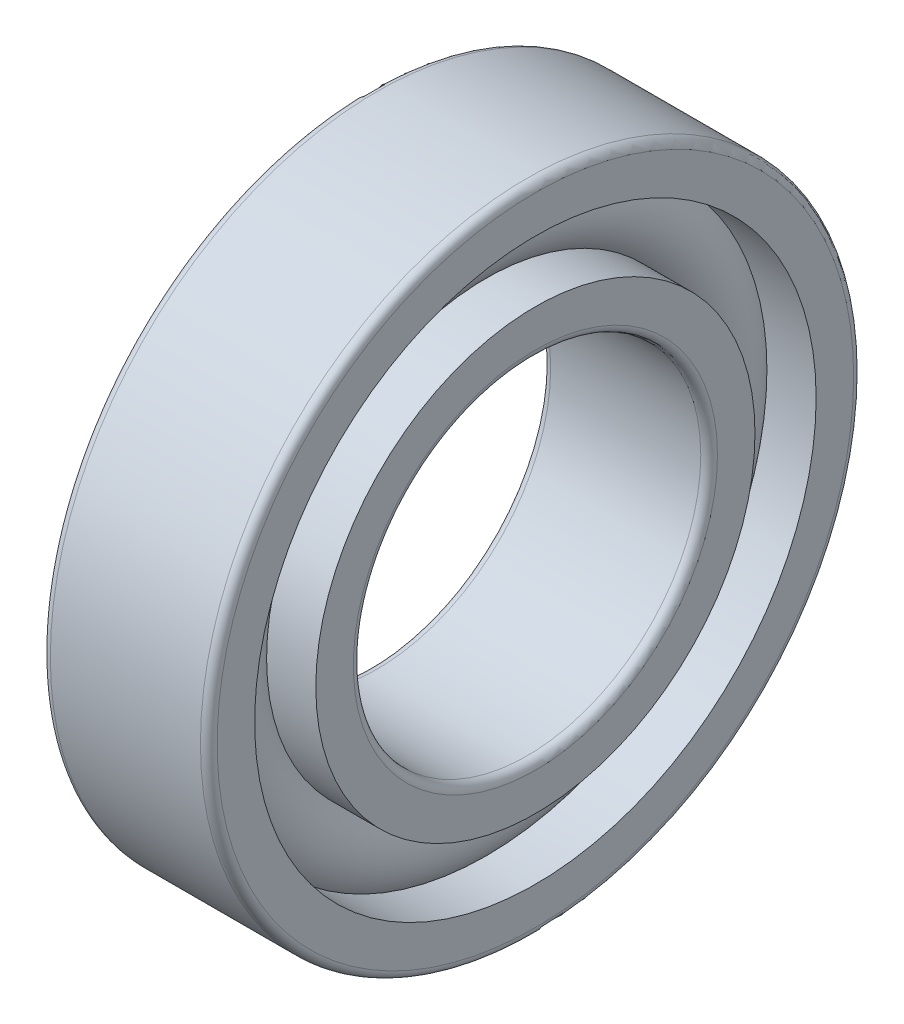
ISO-10303-21;
HEADER;
FILE_DESCRIPTION(('STEP AP214'),'2;1');
FILE_NAME('part.step','',(''),(''),'','','');
FILE_SCHEMA(('AUTOMOTIVE_DESIGN { 1 0 10303 214 1 1 1 1 }'));
ENDSEC;
DATA;
#1=APPLICATION_CONTEXT('core data for automotive mechanical design processes');
#2=APPLICATION_PROTOCOL_DEFINITION('international standard','automotive_design',2000,#1);
#3=PRODUCT_CONTEXT('',#1,'mechanical');
#4=PRODUCT('Part','Part','',(#3));
#5=PRODUCT_RELATED_PRODUCT_CATEGORY('part','',(#4));
#6=PRODUCT_DEFINITION_FORMATION('','',#4);
#7=PRODUCT_DEFINITION_CONTEXT('part definition',#1,'design');
#8=PRODUCT_DEFINITION('design','',#6,#7);
#9=PRODUCT_DEFINITION_SHAPE('','',#8);
#10=(LENGTH_UNIT() NAMED_UNIT(*) SI_UNIT(.MILLI.,.METRE.));
#11=(NAMED_UNIT(*) PLANE_ANGLE_UNIT() SI_UNIT($,.RADIAN.));
#12=(NAMED_UNIT(*) SI_UNIT($,.STERADIAN.) SOLID_ANGLE_UNIT());
#13=UNCERTAINTY_MEASURE_WITH_UNIT(LENGTH_MEASURE(1.E-05),#10,'distance_accuracy_value','');
#14=(GEOMETRIC_REPRESENTATION_CONTEXT(3) GLOBAL_UNCERTAINTY_ASSIGNED_CONTEXT((#13)) GLOBAL_UNIT_ASSIGNED_CONTEXT((#10,
#11,#12)) REPRESENTATION_CONTEXT('',''));
#15=CARTESIAN_POINT('',(0.,0.,0.));
#16=DIRECTION('',(0.,0.,1.));
#17=DIRECTION('',(1.,0.,0.));
#18=AXIS2_PLACEMENT_3D('',#15,#16,#17);
#19=CARTESIAN_POINT('',(0.,0.,0.));
#20=DIRECTION('',(-1.,0.,0.));
#21=DIRECTION('',(0.,0.,1.));
#22=AXIS2_PLACEMENT_3D('',#19,#20,#21);
#23=TOROIDAL_SURFACE('',#22,18.,3.3);
#24=CARTESIAN_POINT('',(2.45967477524977,0.,0.));
#25=DIRECTION('',(-1.,0.,0.));
#26=DIRECTION('',(0.,0.,1.));
#27=AXIS2_PLACEMENT_3D('',#24,#25,#26);
#28=CIRCLE('',#27,20.2);
#29=CARTESIAN_POINT('',(2.45967477524977,0.,20.2));
#30=VERTEX_POINT('',#29);
#31=EDGE_CURVE('E35',#30,#30,#28,.F.);
#32=ORIENTED_EDGE('',*,*,#31,.T.);
#33=EDGE_LOOP('',(#32));
#34=FACE_BOUND('',#33,.T.);
#35=CARTESIAN_POINT('',(2.45967477524977,0.,0.));
#36=DIRECTION('',(-1.,0.,0.));
#37=DIRECTION('',(0.,0.,1.));
#38=AXIS2_PLACEMENT_3D('',#35,#36,#37);
#39=CIRCLE('',#38,15.8);
#40=CARTESIAN_POINT('',(2.45967477524977,0.,15.8));
#41=VERTEX_POINT('',#40);
#42=EDGE_CURVE('E10',#41,#41,#39,.T.);
#43=ORIENTED_EDGE('',*,*,#42,.T.);
#44=EDGE_LOOP('',(#43));
#45=FACE_BOUND('',#44,.T.);
#46=ADVANCED_FACE('F31',(#34,#45),#23,.T.);
#47=CARTESIAN_POINT('',(-20.6375,0.,0.));
#48=DIRECTION('',(1.,0.,0.));
#49=DIRECTION('',(0.,0.,-1.));
#50=AXIS2_PLACEMENT_3D('',#47,#48,#49);
#51=CYLINDRICAL_SURFACE('',#50,15.8);
#52=CARTESIAN_POINT('',(6.,0.,0.));
#53=DIRECTION('',(1.,0.,0.));
#54=DIRECTION('',(0.,0.,-1.));
#55=AXIS2_PLACEMENT_3D('',#52,#53,#54);
#56=CIRCLE('',#55,15.8);
#57=CARTESIAN_POINT('',(6.,0.,-15.8));
#58=VERTEX_POINT('',#57);
#59=EDGE_CURVE('E44',#58,#58,#56,.T.);
#60=ORIENTED_EDGE('',*,*,#59,.F.);
#61=EDGE_LOOP('',(#60));
#62=FACE_BOUND('',#61,.T.);
#63=ORIENTED_EDGE('',*,*,#42,.F.);
#64=EDGE_LOOP('',(#63));
#65=FACE_BOUND('',#64,.T.);
#66=ADVANCED_FACE('F83',(#62,#65),#51,.T.);
#67=CARTESIAN_POINT('',(-20.6375,0.,0.));
#68=DIRECTION('',(1.,0.,0.));
#69=DIRECTION('',(0.,0.,-1.));
#70=AXIS2_PLACEMENT_3D('',#67,#68,#69);
#71=CYLINDRICAL_SURFACE('',#70,15.8);
#72=CARTESIAN_POINT('',(-6.,0.,0.));
#73=DIRECTION('',(1.,0.,0.));
#74=DIRECTION('',(0.,0.,-1.));
#75=AXIS2_PLACEMENT_3D('',#72,#73,#74);
#76=CIRCLE('',#75,15.8);
#77=CARTESIAN_POINT('',(-6.,0.,-15.8));
#78=VERTEX_POINT('',#77);
#79=EDGE_CURVE('E53',#78,#78,#76,.T.);
#80=ORIENTED_EDGE('',*,*,#79,.T.);
#81=EDGE_LOOP('',(#80));
#82=FACE_BOUND('',#81,.T.);
#83=CARTESIAN_POINT('',(-2.45967477524977,0.,0.));
#84=DIRECTION('',(1.,0.,0.));
#85=DIRECTION('',(0.,0.,-1.));
#86=AXIS2_PLACEMENT_3D('',#83,#84,#85);
#87=CIRCLE('',#86,15.8);
#88=CARTESIAN_POINT('',(-2.45967477524977,0.,-15.8));
#89=VERTEX_POINT('',#88);
#90=EDGE_CURVE('E39',#89,#89,#87,.T.);
#91=ORIENTED_EDGE('',*,*,#90,.F.);
#92=EDGE_LOOP('',(#91));
#93=FACE_BOUND('',#92,.T.);
#94=ADVANCED_FACE('F86',(#82,#93),#71,.T.);
#95=CARTESIAN_POINT('',(6.,13.1,0.));
#96=DIRECTION('',(1.,0.,0.));
#97=DIRECTION('',(0.,0.,-1.));
#98=AXIS2_PLACEMENT_3D('',#95,#96,#97);
#99=PLANE('',#98);
#100=ORIENTED_EDGE('',*,*,#59,.T.);
#101=EDGE_LOOP('',(#100));
#102=FACE_BOUND('',#101,.T.);
#103=CARTESIAN_POINT('',(6.,0.,0.));
#104=DIRECTION('',(1.,0.,0.));
#105=DIRECTION('',(0.,0.,-1.));
#106=AXIS2_PLACEMENT_3D('',#103,#104,#105);
#107=CIRCLE('',#106,13.1);
#108=CARTESIAN_POINT('',(6.,0.,-13.1));
#109=VERTEX_POINT('',#108);
#110=EDGE_CURVE('E75',#109,#109,#107,.T.);
#111=ORIENTED_EDGE('',*,*,#110,.F.);
#112=EDGE_LOOP('',(#111));
#113=FACE_BOUND('',#112,.T.);
#114=ADVANCED_FACE('F80',(#102,#113),#99,.T.);
#115=CARTESIAN_POINT('',(5.4,0.,0.));
#116=DIRECTION('',(1.,0.,0.));
#117=DIRECTION('',(0.,0.,-1.));
#118=AXIS2_PLACEMENT_3D('',#115,#116,#117);
#119=TOROIDAL_SURFACE('',#118,13.1,0.600000000000001);
#120=ORIENTED_EDGE('',*,*,#110,.T.);
#121=EDGE_LOOP('',(#120));
#122=FACE_BOUND('',#121,.T.);
#123=CARTESIAN_POINT('',(5.4,0.,0.));
#124=DIRECTION('',(1.,0.,0.));
#125=DIRECTION('',(0.,0.,-1.));
#126=AXIS2_PLACEMENT_3D('',#123,#124,#125);
#127=CIRCLE('',#126,12.5);
#128=CARTESIAN_POINT('',(5.4,0.,-12.5));
#129=VERTEX_POINT('',#128);
#130=EDGE_CURVE('E72',#129,#129,#127,.T.);
#131=ORIENTED_EDGE('',*,*,#130,.F.);
#132=EDGE_LOOP('',(#131));
#133=FACE_BOUND('',#132,.T.);
#134=ADVANCED_FACE('F97',(#122,#133),#119,.T.);
#135=CARTESIAN_POINT('',(-20.6375,0.,0.));
#136=DIRECTION('',(1.,0.,0.));
#137=DIRECTION('',(0.,0.,-1.));
#138=AXIS2_PLACEMENT_3D('',#135,#136,#137);
#139=CYLINDRICAL_SURFACE('',#138,12.5);
#140=ORIENTED_EDGE('',*,*,#130,.T.);
#141=EDGE_LOOP('',(#140));
#142=FACE_BOUND('',#141,.T.);
#143=CARTESIAN_POINT('',(-5.4,0.,0.));
#144=DIRECTION('',(1.,0.,0.));
#145=DIRECTION('',(0.,0.,-1.));
#146=AXIS2_PLACEMENT_3D('',#143,#144,#145);
#147=CIRCLE('',#146,12.5);
#148=CARTESIAN_POINT('',(-5.4,0.,-12.5));
#149=VERTEX_POINT('',#148);
#150=EDGE_CURVE('E69',#149,#149,#147,.T.);
#151=ORIENTED_EDGE('',*,*,#150,.F.);
#152=EDGE_LOOP('',(#151));
#153=FACE_BOUND('',#152,.T.);
#154=ADVANCED_FACE('F100',(#142,#153),#139,.F.);
#155=CARTESIAN_POINT('',(-5.4,0.,0.));
#156=DIRECTION('',(1.,0.,0.));
#157=DIRECTION('',(0.,0.,-1.));
#158=AXIS2_PLACEMENT_3D('',#155,#156,#157);
#159=TOROIDAL_SURFACE('',#158,13.1,0.600000000000001);
#160=ORIENTED_EDGE('',*,*,#150,.T.);
#161=EDGE_LOOP('',(#160));
#162=FACE_BOUND('',#161,.T.);
#163=CARTESIAN_POINT('',(-6.,0.,0.));
#164=DIRECTION('',(1.,0.,0.));
#165=DIRECTION('',(0.,0.,-1.));
#166=AXIS2_PLACEMENT_3D('',#163,#164,#165);
#167=CIRCLE('',#166,13.1);
#168=CARTESIAN_POINT('',(-6.,0.,-13.1));
#169=VERTEX_POINT('',#168);
#170=EDGE_CURVE('E66',#169,#169,#167,.T.);
#171=ORIENTED_EDGE('',*,*,#170,.F.);
#172=EDGE_LOOP('',(#171));
#173=FACE_BOUND('',#172,.T.);
#174=ADVANCED_FACE('F104',(#162,#173),#159,.T.);
#175=CARTESIAN_POINT('',(-6.,15.8,0.));
#176=DIRECTION('',(-1.,0.,0.));
#177=DIRECTION('',(0.,0.,1.));
#178=AXIS2_PLACEMENT_3D('',#175,#176,#177);
#179=PLANE('',#178);
#180=ORIENTED_EDGE('',*,*,#170,.T.);
#181=EDGE_LOOP('',(#180));
#182=FACE_BOUND('',#181,.T.);
#183=ORIENTED_EDGE('',*,*,#79,.F.);
#184=EDGE_LOOP('',(#183));
#185=FACE_BOUND('',#184,.T.);
#186=ADVANCED_FACE('F108',(#182,#185),#179,.T.);
#187=CARTESIAN_POINT('',(-2.45967477524977,0.,0.));
#188=DIRECTION('',(1.,0.,0.));
#189=DIRECTION('',(0.,0.,-1.));
#190=AXIS2_PLACEMENT_3D('',#187,#188,#189);
#191=CIRCLE('',#190,20.2);
#192=CARTESIAN_POINT('',(-2.45967477524977,0.,-20.2));
#193=VERTEX_POINT('',#192);
#194=EDGE_CURVE('E47',#193,#193,#191,.F.);
#195=ORIENTED_EDGE('',*,*,#194,.T.);
#196=EDGE_LOOP('',(#195));
#197=FACE_BOUND('',#196,.T.);
#198=ORIENTED_EDGE('',*,*,#90,.T.);
#199=EDGE_LOOP('',(#198));
#200=FACE_BOUND('',#199,.T.);
#201=ADVANCED_FACE('F33',(#197,#200),#23,.T.);
#202=CARTESIAN_POINT('',(-20.6375,0.,0.));
#203=DIRECTION('',(1.,0.,0.));
#204=DIRECTION('',(0.,0.,-1.));
#205=AXIS2_PLACEMENT_3D('',#202,#203,#204);
#206=CYLINDRICAL_SURFACE('',#205,20.2);
#207=CARTESIAN_POINT('',(6.,0.,0.));
#208=DIRECTION('',(1.,0.,0.));
#209=DIRECTION('',(0.,0.,-1.));
#210=AXIS2_PLACEMENT_3D('',#207,#208,#209);
#211=CIRCLE('',#210,20.2);
#212=CARTESIAN_POINT('',(6.,0.,-20.2));
#213=VERTEX_POINT('',#212);
#214=EDGE_CURVE('E49',#213,#213,#211,.T.);
#215=ORIENTED_EDGE('',*,*,#214,.T.);
#216=EDGE_LOOP('',(#215));
#217=FACE_BOUND('',#216,.T.);
#218=ORIENTED_EDGE('',*,*,#31,.F.);
#219=EDGE_LOOP('',(#218));
#220=FACE_BOUND('',#219,.T.);
#221=ADVANCED_FACE('F113',(#217,#220),#206,.F.);
#222=CARTESIAN_POINT('',(-20.6375,0.,0.));
#223=DIRECTION('',(1.,0.,0.));
#224=DIRECTION('',(0.,0.,-1.));
#225=AXIS2_PLACEMENT_3D('',#222,#223,#224);
#226=CYLINDRICAL_SURFACE('',#225,20.2);
#227=CARTESIAN_POINT('',(-6.,0.,0.));
#228=DIRECTION('',(1.,0.,0.));
#229=DIRECTION('',(0.,0.,-1.));
#230=AXIS2_PLACEMENT_3D('',#227,#228,#229);
#231=CIRCLE('',#230,20.2);
#232=CARTESIAN_POINT('',(-6.,0.,-20.2));
#233=VERTEX_POINT('',#232);
#234=EDGE_CURVE('E144',#233,#233,#231,.T.);
#235=ORIENTED_EDGE('',*,*,#234,.F.);
#236=EDGE_LOOP('',(#235));
#237=FACE_BOUND('',#236,.T.);
#238=ORIENTED_EDGE('',*,*,#194,.F.);
#239=EDGE_LOOP('',(#238));
#240=FACE_BOUND('',#239,.T.);
#241=ADVANCED_FACE('F116',(#237,#240),#226,.F.);
#242=CARTESIAN_POINT('',(6.,22.9,0.));
#243=DIRECTION('',(1.,0.,0.));
#244=DIRECTION('',(0.,0.,-1.));
#245=AXIS2_PLACEMENT_3D('',#242,#243,#244);
#246=PLANE('',#245);
#247=CARTESIAN_POINT('',(6.,0.,0.));
#248=DIRECTION('',(1.,0.,0.));
#249=DIRECTION('',(0.,0.,-1.));
#250=AXIS2_PLACEMENT_3D('',#247,#248,#249);
#251=CIRCLE('',#250,22.9);
#252=CARTESIAN_POINT('',(6.,0.,-22.9));
#253=VERTEX_POINT('',#252);
#254=EDGE_CURVE('E55',#253,#253,#251,.T.);
#255=ORIENTED_EDGE('',*,*,#254,.T.);
#256=EDGE_LOOP('',(#255));
#257=FACE_BOUND('',#256,.T.);
#258=ORIENTED_EDGE('',*,*,#214,.F.);
#259=EDGE_LOOP('',(#258));
#260=FACE_BOUND('',#259,.T.);
#261=ADVANCED_FACE('F117',(#257,#260),#246,.T.);
#262=CARTESIAN_POINT('',(5.4,0.,0.));
#263=DIRECTION('',(1.,0.,0.));
#264=DIRECTION('',(0.,0.,-1.));
#265=AXIS2_PLACEMENT_3D('',#262,#263,#264);
#266=TOROIDAL_SURFACE('',#265,22.9,0.6);
#267=CARTESIAN_POINT('',(5.4,0.,0.));
#268=DIRECTION('',(1.,0.,0.));
#269=DIRECTION('',(0.,0.,-1.));
#270=AXIS2_PLACEMENT_3D('',#267,#268,#269);
#271=CIRCLE('',#270,23.5);
#272=CARTESIAN_POINT('',(5.4,0.,-23.5));
#273=VERTEX_POINT('',#272);
#274=EDGE_CURVE('E60',#273,#273,#271,.T.);
#275=ORIENTED_EDGE('',*,*,#274,.T.);
#276=EDGE_LOOP('',(#275));
#277=FACE_BOUND('',#276,.T.);
#278=ORIENTED_EDGE('',*,*,#254,.F.);
#279=EDGE_LOOP('',(#278));
#280=FACE_BOUND('',#279,.T.);
#281=ADVANCED_FACE('F120',(#277,#280),#266,.T.);
#282=CARTESIAN_POINT('',(-20.6375,0.,0.));
#283=DIRECTION('',(1.,0.,0.));
#284=DIRECTION('',(0.,0.,-1.));
#285=AXIS2_PLACEMENT_3D('',#282,#283,#284);
#286=CYLINDRICAL_SURFACE('',#285,23.5);
#287=CARTESIAN_POINT('',(-5.4,0.,0.));
#288=DIRECTION('',(1.,0.,0.));
#289=DIRECTION('',(0.,0.,-1.));
#290=AXIS2_PLACEMENT_3D('',#287,#288,#289);
#291=CIRCLE('',#290,23.5);
#292=CARTESIAN_POINT('',(-5.4,0.,-23.5));
#293=VERTEX_POINT('',#292);
#294=EDGE_CURVE('E148',#293,#293,#291,.T.);
#295=ORIENTED_EDGE('',*,*,#294,.T.);
#296=EDGE_LOOP('',(#295));
#297=FACE_BOUND('',#296,.T.);
#298=ORIENTED_EDGE('',*,*,#274,.F.);
#299=EDGE_LOOP('',(#298));
#300=FACE_BOUND('',#299,.T.);
#301=ADVANCED_FACE('F124',(#297,#300),#286,.T.);
#302=CARTESIAN_POINT('',(-5.4,0.,0.));
#303=DIRECTION('',(1.,0.,0.));
#304=DIRECTION('',(0.,0.,-1.));
#305=AXIS2_PLACEMENT_3D('',#302,#303,#304);
#306=TOROIDAL_SURFACE('',#305,22.9,0.6);
#307=CARTESIAN_POINT('',(-6.,0.,0.));
#308=DIRECTION('',(1.,0.,0.));
#309=DIRECTION('',(0.,0.,-1.));
#310=AXIS2_PLACEMENT_3D('',#307,#308,#309);
#311=CIRCLE('',#310,22.9);
#312=CARTESIAN_POINT('',(-6.,0.,-22.9));
#313=VERTEX_POINT('',#312);
#314=EDGE_CURVE('E145',#313,#313,#311,.T.);
#315=ORIENTED_EDGE('',*,*,#314,.T.);
#316=EDGE_LOOP('',(#315));
#317=FACE_BOUND('',#316,.T.);
#318=ORIENTED_EDGE('',*,*,#294,.F.);
#319=EDGE_LOOP('',(#318));
#320=FACE_BOUND('',#319,.T.);
#321=ADVANCED_FACE('F128',(#317,#320),#306,.T.);
#322=CARTESIAN_POINT('',(-6.,20.2,0.));
#323=DIRECTION('',(-1.,0.,0.));
#324=DIRECTION('',(0.,0.,1.));
#325=AXIS2_PLACEMENT_3D('',#322,#323,#324);
#326=PLANE('',#325);
#327=ORIENTED_EDGE('',*,*,#234,.T.);
#328=EDGE_LOOP('',(#327));
#329=FACE_BOUND('',#328,.T.);
#330=ORIENTED_EDGE('',*,*,#314,.F.);
#331=EDGE_LOOP('',(#330));
#332=FACE_BOUND('',#331,.T.);
#333=ADVANCED_FACE('F132',(#329,#332),#326,.T.);
#334=CLOSED_SHELL('',(#46,#66,#94,#114,#134,#154,#174,#186,#201,#221,#241,#261,#281,#301,#321,#333));
#335=MANIFOLD_SOLID_BREP('B2',#334);
#336=ADVANCED_BREP_SHAPE_REPRESENTATION('',(#18,#335),#14);
#337=SHAPE_DEFINITION_REPRESENTATION(#9,#336);
ENDSEC;
END-ISO-10303-21;
